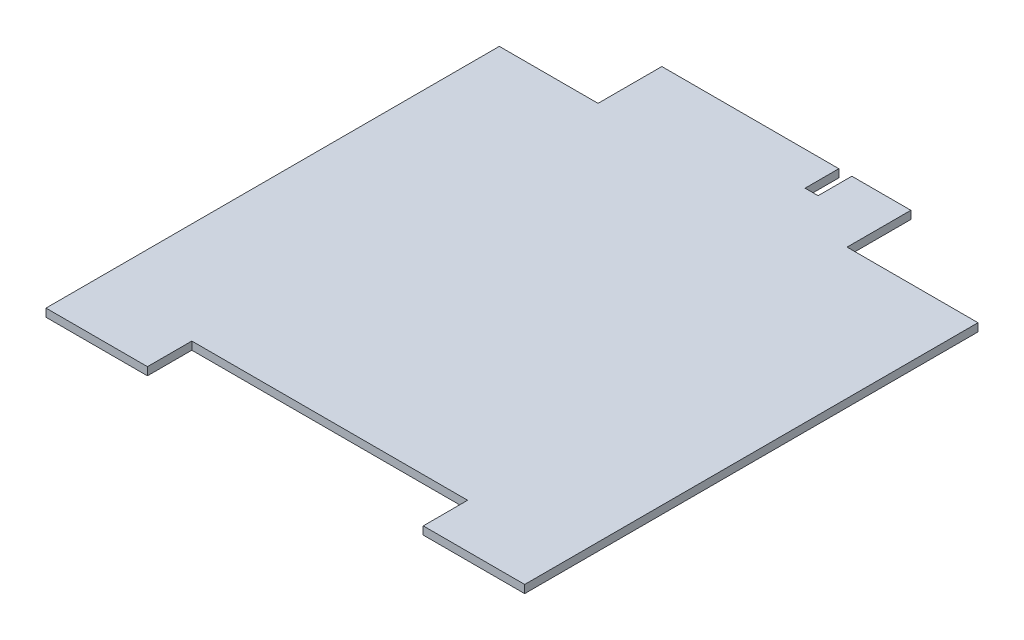
ISO-10303-21;
HEADER;
FILE_DESCRIPTION(('STEP AP214'),'2;1');
FILE_NAME('part.step','',(''),(''),'','','');
FILE_SCHEMA(('AUTOMOTIVE_DESIGN { 1 0 10303 214 1 1 1 1 }'));
ENDSEC;
DATA;
#1=APPLICATION_CONTEXT('core data for automotive mechanical design processes');
#2=APPLICATION_PROTOCOL_DEFINITION('international standard','automotive_design',2000,#1);
#3=PRODUCT_CONTEXT('',#1,'mechanical');
#4=PRODUCT('Part','Part','',(#3));
#5=PRODUCT_RELATED_PRODUCT_CATEGORY('part','',(#4));
#6=PRODUCT_DEFINITION_FORMATION('','',#4);
#7=PRODUCT_DEFINITION_CONTEXT('part definition',#1,'design');
#8=PRODUCT_DEFINITION('design','',#6,#7);
#9=PRODUCT_DEFINITION_SHAPE('','',#8);
#10=(LENGTH_UNIT() NAMED_UNIT(*) SI_UNIT(.MILLI.,.METRE.));
#11=(NAMED_UNIT(*) PLANE_ANGLE_UNIT() SI_UNIT($,.RADIAN.));
#12=(NAMED_UNIT(*) SI_UNIT($,.STERADIAN.) SOLID_ANGLE_UNIT());
#13=UNCERTAINTY_MEASURE_WITH_UNIT(LENGTH_MEASURE(1.E-05),#10,'distance_accuracy_value','');
#14=(GEOMETRIC_REPRESENTATION_CONTEXT(3) GLOBAL_UNCERTAINTY_ASSIGNED_CONTEXT((#13)) GLOBAL_UNIT_ASSIGNED_CONTEXT((#10,
#11,#12)) REPRESENTATION_CONTEXT('',''));
#15=CARTESIAN_POINT('',(0.,0.,0.));
#16=DIRECTION('',(0.,0.,1.));
#17=DIRECTION('',(1.,0.,0.));
#18=AXIS2_PLACEMENT_3D('',#15,#16,#17);
#19=CARTESIAN_POINT('',(0.,1.6,45.4025));
#20=DIRECTION('',(0.,0.,-1.));
#21=DIRECTION('',(-1.,0.,0.));
#22=AXIS2_PLACEMENT_3D('',#19,#20,#21);
#23=PLANE('',#22);
#24=DIRECTION('',(1.,0.,0.));
#25=VECTOR('',#24,1.);
#26=CARTESIAN_POINT('',(0.,0.,45.4025));
#27=LINE('',#26,#25);
#28=CARTESIAN_POINT('',(-47.9425,0.,45.4025));
#29=VERTEX_POINT('',#28);
#30=CARTESIAN_POINT('',(-27.6225,0.,45.4025));
#31=VERTEX_POINT('',#30);
#32=EDGE_CURVE('E174',#29,#31,#27,.T.);
#33=ORIENTED_EDGE('',*,*,#32,.T.);
#34=DIRECTION('',(0.,1.,0.));
#35=VECTOR('',#34,1.);
#36=CARTESIAN_POINT('',(-27.6225,-55.9557157491529,45.4025));
#37=LINE('',#36,#35);
#38=CARTESIAN_POINT('',(-27.6225,1.6,45.4025));
#39=VERTEX_POINT('',#38);
#40=EDGE_CURVE('E156',#31,#39,#37,.T.);
#41=ORIENTED_EDGE('',*,*,#40,.T.);
#42=DIRECTION('',(1.,0.,0.));
#43=VECTOR('',#42,1.);
#44=CARTESIAN_POINT('',(0.,1.6,45.4025));
#45=LINE('',#44,#43);
#46=CARTESIAN_POINT('',(-47.9425,1.6,45.4025));
#47=VERTEX_POINT('',#46);
#48=EDGE_CURVE('E171',#47,#39,#45,.T.);
#49=ORIENTED_EDGE('',*,*,#48,.F.);
#50=DIRECTION('',(0.,-1.,0.));
#51=VECTOR('',#50,1.);
#52=CARTESIAN_POINT('',(-47.9425,1.6,45.4025));
#53=LINE('',#52,#51);
#54=EDGE_CURVE('E251',#47,#29,#53,.T.);
#55=ORIENTED_EDGE('',*,*,#54,.T.);
#56=EDGE_LOOP('',(#33,#41,#49,#55));
#57=FACE_BOUND('',#56,.T.);
#58=ADVANCED_FACE('F41',(#57),#23,.F.);
#59=CARTESIAN_POINT('',(0.,1.6,-58.1828881425));
#60=DIRECTION('',(0.,0.,-1.));
#61=DIRECTION('',(-1.,0.,0.));
#62=AXIS2_PLACEMENT_3D('',#59,#60,#61);
#63=PLANE('',#62);
#64=DIRECTION('',(0.,1.,0.));
#65=VECTOR('',#64,1.);
#66=CARTESIAN_POINT('',(7.28257435357213,-55.9557157491529,-58.1828881425));
#67=LINE('',#66,#65);
#68=CARTESIAN_POINT('',(7.28257435357213,0.,-58.1828881425));
#69=VERTEX_POINT('',#68);
#70=CARTESIAN_POINT('',(7.28257435357213,1.6,-58.1828881425));
#71=VERTEX_POINT('',#70);
#72=EDGE_CURVE('E288',#69,#71,#67,.T.);
#73=ORIENTED_EDGE('',*,*,#72,.F.);
#74=DIRECTION('',(1.,0.,0.));
#75=VECTOR('',#74,1.);
#76=CARTESIAN_POINT('',(0.,0.,-58.1828881425));
#77=LINE('',#76,#75);
#78=CARTESIAN_POINT('',(-28.1675306770798,0.,-58.1828881425));
#79=VERTEX_POINT('',#78);
#80=EDGE_CURVE('E230',#79,#69,#77,.T.);
#81=ORIENTED_EDGE('',*,*,#80,.F.);
#82=DIRECTION('',(0.,-1.,0.));
#83=VECTOR('',#82,1.);
#84=CARTESIAN_POINT('',(-28.1675306770798,1.6,-58.1828881425));
#85=LINE('',#84,#83);
#86=CARTESIAN_POINT('',(-28.1675306770798,1.6,-58.1828881425));
#87=VERTEX_POINT('',#86);
#88=EDGE_CURVE('E203',#87,#79,#85,.T.);
#89=ORIENTED_EDGE('',*,*,#88,.F.);
#90=DIRECTION('',(1.,0.,0.));
#91=VECTOR('',#90,1.);
#92=CARTESIAN_POINT('',(0.,1.6,-58.1828881425));
#93=LINE('',#92,#91);
#94=EDGE_CURVE('E199',#87,#71,#93,.T.);
#95=ORIENTED_EDGE('',*,*,#94,.T.);
#96=EDGE_LOOP('',(#73,#81,#89,#95));
#97=FACE_BOUND('',#96,.T.);
#98=ADVANCED_FACE('F359',(#97),#63,.T.);
#99=CARTESIAN_POINT('',(-28.1675306770798,1.6,0.));
#100=DIRECTION('',(-1.,0.,0.));
#101=DIRECTION('',(0.,0.,1.));
#102=AXIS2_PLACEMENT_3D('',#99,#100,#101);
#103=PLANE('',#102);
#104=DIRECTION('',(0.,0.,-1.));
#105=VECTOR('',#104,1.);
#106=CARTESIAN_POINT('',(-28.1675306770798,0.,0.));
#107=LINE('',#106,#105);
#108=CARTESIAN_POINT('',(-28.1675306770798,0.,-45.4025));
#109=VERTEX_POINT('',#108);
#110=EDGE_CURVE('E204',#109,#79,#107,.T.);
#111=ORIENTED_EDGE('',*,*,#110,.F.);
#112=DIRECTION('',(0.,-1.,0.));
#113=VECTOR('',#112,1.);
#114=CARTESIAN_POINT('',(-28.1675306770798,1.6,-45.4025));
#115=LINE('',#114,#113);
#116=CARTESIAN_POINT('',(-28.1675306770798,1.6,-45.4025));
#117=VERTEX_POINT('',#116);
#118=EDGE_CURVE('E11',#117,#109,#115,.T.);
#119=ORIENTED_EDGE('',*,*,#118,.F.);
#120=DIRECTION('',(0.,0.,-1.));
#121=VECTOR('',#120,1.);
#122=CARTESIAN_POINT('',(-28.1675306770798,1.6,0.));
#123=LINE('',#122,#121);
#124=EDGE_CURVE('E234',#117,#87,#123,.T.);
#125=ORIENTED_EDGE('',*,*,#124,.T.);
#126=ORIENTED_EDGE('',*,*,#88,.T.);
#127=EDGE_LOOP('',(#111,#119,#125,#126));
#128=FACE_BOUND('',#127,.T.);
#129=ADVANCED_FACE('F43',(#128),#103,.T.);
#130=CARTESIAN_POINT('',(0.,1.6,-45.4025));
#131=DIRECTION('',(0.,0.,-1.));
#132=DIRECTION('',(-1.,0.,0.));
#133=AXIS2_PLACEMENT_3D('',#130,#131,#132);
#134=PLANE('',#133);
#135=DIRECTION('',(1.,0.,0.));
#136=VECTOR('',#135,1.);
#137=CARTESIAN_POINT('',(0.,0.,-45.4025));
#138=LINE('',#137,#136);
#139=CARTESIAN_POINT('',(-47.9425,0.,-45.4025));
#140=VERTEX_POINT('',#139);
#141=EDGE_CURVE('E208',#140,#109,#138,.T.);
#142=ORIENTED_EDGE('',*,*,#141,.F.);
#143=DIRECTION('',(0.,-1.,0.));
#144=VECTOR('',#143,1.);
#145=CARTESIAN_POINT('',(-47.9425,1.6,-45.4025));
#146=LINE('',#145,#144);
#147=CARTESIAN_POINT('',(-47.9425,1.6,-45.4025));
#148=VERTEX_POINT('',#147);
#149=EDGE_CURVE('E50',#148,#140,#146,.T.);
#150=ORIENTED_EDGE('',*,*,#149,.F.);
#151=DIRECTION('',(1.,0.,0.));
#152=VECTOR('',#151,1.);
#153=CARTESIAN_POINT('',(0.,1.6,-45.4025));
#154=LINE('',#153,#152);
#155=EDGE_CURVE('E316',#148,#117,#154,.T.);
#156=ORIENTED_EDGE('',*,*,#155,.T.);
#157=ORIENTED_EDGE('',*,*,#118,.T.);
#158=EDGE_LOOP('',(#142,#150,#156,#157));
#159=FACE_BOUND('',#158,.T.);
#160=ADVANCED_FACE('F260',(#159),#134,.T.);
#161=CARTESIAN_POINT('',(-47.9425,1.6,0.));
#162=DIRECTION('',(-1.,0.,0.));
#163=DIRECTION('',(0.,0.,1.));
#164=AXIS2_PLACEMENT_3D('',#161,#162,#163);
#165=PLANE('',#164);
#166=DIRECTION('',(0.,0.,-1.));
#167=VECTOR('',#166,1.);
#168=CARTESIAN_POINT('',(-47.9425,0.,0.));
#169=LINE('',#168,#167);
#170=EDGE_CURVE('E213',#29,#140,#169,.T.);
#171=ORIENTED_EDGE('',*,*,#170,.F.);
#172=ORIENTED_EDGE('',*,*,#54,.F.);
#173=DIRECTION('',(0.,0.,-1.));
#174=VECTOR('',#173,1.);
#175=CARTESIAN_POINT('',(-47.9425,1.6,0.));
#176=LINE('',#175,#174);
#177=EDGE_CURVE('E182',#47,#148,#176,.T.);
#178=ORIENTED_EDGE('',*,*,#177,.T.);
#179=ORIENTED_EDGE('',*,*,#149,.T.);
#180=EDGE_LOOP('',(#171,#172,#178,#179));
#181=FACE_BOUND('',#180,.T.);
#182=ADVANCED_FACE('F257',(#181),#165,.T.);
#183=CARTESIAN_POINT('',(27.6225,1.6,45.4025));
#184=VERTEX_POINT('',#183);
#185=CARTESIAN_POINT('',(47.9425,1.6,45.4025));
#186=VERTEX_POINT('',#185);
#187=EDGE_CURVE('E185',#184,#186,#45,.T.);
#188=ORIENTED_EDGE('',*,*,#187,.F.);
#189=DIRECTION('',(0.,1.,0.));
#190=VECTOR('',#189,1.);
#191=CARTESIAN_POINT('',(27.6225,-55.9557157491529,45.4025));
#192=LINE('',#191,#190);
#193=CARTESIAN_POINT('',(27.6225,0.,45.4025));
#194=VERTEX_POINT('',#193);
#195=EDGE_CURVE('E176',#194,#184,#192,.T.);
#196=ORIENTED_EDGE('',*,*,#195,.F.);
#197=CARTESIAN_POINT('',(47.9425,0.,45.4025));
#198=VERTEX_POINT('',#197);
#199=EDGE_CURVE('E218',#194,#198,#27,.T.);
#200=ORIENTED_EDGE('',*,*,#199,.T.);
#201=DIRECTION('',(0.,-1.,0.));
#202=VECTOR('',#201,1.);
#203=CARTESIAN_POINT('',(47.9425,1.6,45.4025));
#204=LINE('',#203,#202);
#205=EDGE_CURVE('E247',#186,#198,#204,.T.);
#206=ORIENTED_EDGE('',*,*,#205,.F.);
#207=EDGE_LOOP('',(#188,#196,#200,#206));
#208=FACE_BOUND('',#207,.T.);
#209=ADVANCED_FACE('F344',(#208),#23,.F.);
#210=CARTESIAN_POINT('',(47.9425,1.6,0.));
#211=DIRECTION('',(-1.,0.,0.));
#212=DIRECTION('',(0.,0.,1.));
#213=AXIS2_PLACEMENT_3D('',#210,#211,#212);
#214=PLANE('',#213);
#215=DIRECTION('',(0.,0.,-1.));
#216=VECTOR('',#215,1.);
#217=CARTESIAN_POINT('',(47.9425,0.,0.));
#218=LINE('',#217,#216);
#219=CARTESIAN_POINT('',(47.9425,0.,-45.4025));
#220=VERTEX_POINT('',#219);
#221=EDGE_CURVE('E221',#198,#220,#218,.T.);
#222=ORIENTED_EDGE('',*,*,#221,.T.);
#223=DIRECTION('',(0.,-1.,0.));
#224=VECTOR('',#223,1.);
#225=CARTESIAN_POINT('',(47.9425,1.6,-45.4025));
#226=LINE('',#225,#224);
#227=CARTESIAN_POINT('',(47.9425,1.6,-45.4025));
#228=VERTEX_POINT('',#227);
#229=EDGE_CURVE('E244',#228,#220,#226,.T.);
#230=ORIENTED_EDGE('',*,*,#229,.F.);
#231=DIRECTION('',(0.,0.,-1.));
#232=VECTOR('',#231,1.);
#233=CARTESIAN_POINT('',(47.9425,1.6,0.));
#234=LINE('',#233,#232);
#235=EDGE_CURVE('E184',#186,#228,#234,.T.);
#236=ORIENTED_EDGE('',*,*,#235,.F.);
#237=ORIENTED_EDGE('',*,*,#205,.T.);
#238=EDGE_LOOP('',(#222,#230,#236,#237));
#239=FACE_BOUND('',#238,.T.);
#240=ADVANCED_FACE('F334',(#239),#214,.F.);
#241=CARTESIAN_POINT('',(21.71330638,0.,-45.4025));
#242=VERTEX_POINT('',#241);
#243=EDGE_CURVE('E214',#242,#220,#138,.T.);
#244=ORIENTED_EDGE('',*,*,#243,.F.);
#245=DIRECTION('',(0.,-1.,0.));
#246=VECTOR('',#245,1.);
#247=CARTESIAN_POINT('',(21.71330638,1.6,-45.4025));
#248=LINE('',#247,#246);
#249=CARTESIAN_POINT('',(21.71330638,1.6,-45.4025));
#250=VERTEX_POINT('',#249);
#251=EDGE_CURVE('E241',#250,#242,#248,.T.);
#252=ORIENTED_EDGE('',*,*,#251,.F.);
#253=EDGE_CURVE('E189',#250,#228,#154,.T.);
#254=ORIENTED_EDGE('',*,*,#253,.T.);
#255=ORIENTED_EDGE('',*,*,#229,.T.);
#256=EDGE_LOOP('',(#244,#252,#254,#255));
#257=FACE_BOUND('',#256,.T.);
#258=ADVANCED_FACE('F324',(#257),#134,.T.);
#259=CARTESIAN_POINT('',(21.71330638,1.6,0.));
#260=DIRECTION('',(-1.,0.,0.));
#261=DIRECTION('',(0.,0.,1.));
#262=AXIS2_PLACEMENT_3D('',#259,#260,#261);
#263=PLANE('',#262);
#264=DIRECTION('',(0.,0.,-1.));
#265=VECTOR('',#264,1.);
#266=CARTESIAN_POINT('',(21.71330638,0.,0.));
#267=LINE('',#266,#265);
#268=CARTESIAN_POINT('',(21.71330638,0.,-58.1828881425));
#269=VERTEX_POINT('',#268);
#270=EDGE_CURVE('E225',#242,#269,#267,.T.);
#271=ORIENTED_EDGE('',*,*,#270,.T.);
#272=DIRECTION('',(0.,-1.,0.));
#273=VECTOR('',#272,1.);
#274=CARTESIAN_POINT('',(21.71330638,1.6,-58.1828881425));
#275=LINE('',#274,#273);
#276=CARTESIAN_POINT('',(21.71330638,1.6,-58.1828881425));
#277=VERTEX_POINT('',#276);
#278=EDGE_CURVE('E237',#277,#269,#275,.T.);
#279=ORIENTED_EDGE('',*,*,#278,.F.);
#280=DIRECTION('',(0.,0.,-1.));
#281=VECTOR('',#280,1.);
#282=CARTESIAN_POINT('',(21.71330638,1.6,0.));
#283=LINE('',#282,#281);
#284=EDGE_CURVE('E194',#250,#277,#283,.T.);
#285=ORIENTED_EDGE('',*,*,#284,.F.);
#286=ORIENTED_EDGE('',*,*,#251,.T.);
#287=EDGE_LOOP('',(#271,#279,#285,#286));
#288=FACE_BOUND('',#287,.T.);
#289=ADVANCED_FACE('F383',(#288),#263,.F.);
#290=DIRECTION('',(0.,1.,0.));
#291=VECTOR('',#290,1.);
#292=CARTESIAN_POINT('',(9.89330855579612,-55.9557157491529,-58.1828881425));
#293=LINE('',#292,#291);
#294=CARTESIAN_POINT('',(9.89330855579612,0.,-58.1828881425));
#295=VERTEX_POINT('',#294);
#296=CARTESIAN_POINT('',(9.89330855579612,1.6,-58.1828881425));
#297=VERTEX_POINT('',#296);
#298=EDGE_CURVE('E304',#295,#297,#293,.T.);
#299=ORIENTED_EDGE('',*,*,#298,.T.);
#300=EDGE_CURVE('E198',#297,#277,#93,.T.);
#301=ORIENTED_EDGE('',*,*,#300,.T.);
#302=ORIENTED_EDGE('',*,*,#278,.T.);
#303=EDGE_CURVE('E229',#295,#269,#77,.T.);
#304=ORIENTED_EDGE('',*,*,#303,.F.);
#305=EDGE_LOOP('',(#299,#301,#302,#304));
#306=FACE_BOUND('',#305,.T.);
#307=ADVANCED_FACE('F366',(#306),#63,.T.);
#308=CARTESIAN_POINT('',(0.,1.6,0.));
#309=DIRECTION('',(0.,1.,0.));
#310=DIRECTION('',(0.,0.,1.));
#311=AXIS2_PLACEMENT_3D('',#308,#309,#310);
#312=PLANE('',#311);
#313=DIRECTION('',(0.,0.,1.));
#314=VECTOR('',#313,1.);
#315=CARTESIAN_POINT('',(-27.6225,1.6,45.4025));
#316=LINE('',#315,#314);
#317=CARTESIAN_POINT('',(-27.6225,1.6,36.5125));
#318=VERTEX_POINT('',#317);
#319=EDGE_CURVE('E153',#318,#39,#316,.T.);
#320=ORIENTED_EDGE('',*,*,#319,.F.);
#321=DIRECTION('',(-1.,0.,0.));
#322=VECTOR('',#321,1.);
#323=CARTESIAN_POINT('',(-27.6225,1.6,36.5125));
#324=LINE('',#323,#322);
#325=CARTESIAN_POINT('',(27.6225,1.6,36.5125));
#326=VERTEX_POINT('',#325);
#327=EDGE_CURVE('E177',#326,#318,#324,.T.);
#328=ORIENTED_EDGE('',*,*,#327,.F.);
#329=DIRECTION('',(0.,0.,-1.));
#330=VECTOR('',#329,1.);
#331=CARTESIAN_POINT('',(27.6225,1.6,45.4025));
#332=LINE('',#331,#330);
#333=EDGE_CURVE('E165',#184,#326,#332,.T.);
#334=ORIENTED_EDGE('',*,*,#333,.F.);
#335=ORIENTED_EDGE('',*,*,#187,.T.);
#336=ORIENTED_EDGE('',*,*,#235,.T.);
#337=ORIENTED_EDGE('',*,*,#253,.F.);
#338=ORIENTED_EDGE('',*,*,#284,.T.);
#339=ORIENTED_EDGE('',*,*,#300,.F.);
#340=DIRECTION('',(0.,0.,-1.));
#341=VECTOR('',#340,1.);
#342=CARTESIAN_POINT('',(9.89330855579612,1.6,-58.1828881425));
#343=LINE('',#342,#341);
#344=CARTESIAN_POINT('',(9.89330855579612,1.6,-51.4228881425));
#345=VERTEX_POINT('',#344);
#346=EDGE_CURVE('E298',#345,#297,#343,.T.);
#347=ORIENTED_EDGE('',*,*,#346,.F.);
#348=DIRECTION('',(1.,0.,0.));
#349=VECTOR('',#348,1.);
#350=CARTESIAN_POINT('',(7.28257435357213,1.6,-51.4228881425));
#351=LINE('',#350,#349);
#352=CARTESIAN_POINT('',(7.28257435357213,1.6,-51.4228881425));
#353=VERTEX_POINT('',#352);
#354=EDGE_CURVE('E295',#353,#345,#351,.T.);
#355=ORIENTED_EDGE('',*,*,#354,.F.);
#356=DIRECTION('',(0.,0.,1.));
#357=VECTOR('',#356,1.);
#358=CARTESIAN_POINT('',(7.28257435357213,1.6,-58.1828881425));
#359=LINE('',#358,#357);
#360=EDGE_CURVE('E291',#71,#353,#359,.T.);
#361=ORIENTED_EDGE('',*,*,#360,.F.);
#362=ORIENTED_EDGE('',*,*,#94,.F.);
#363=ORIENTED_EDGE('',*,*,#124,.F.);
#364=ORIENTED_EDGE('',*,*,#155,.F.);
#365=ORIENTED_EDGE('',*,*,#177,.F.);
#366=ORIENTED_EDGE('',*,*,#48,.T.);
#367=EDGE_LOOP('',(#320,#328,#334,#335,#336,#337,#338,#339,#347,#355,#361,#362,#363,#364,#365,#366));
#368=FACE_BOUND('',#367,.T.);
#369=ADVANCED_FACE('F179',(#368),#312,.T.);
#370=CARTESIAN_POINT('',(0.,0.,0.));
#371=DIRECTION('',(0.,1.,0.));
#372=DIRECTION('',(0.,0.,1.));
#373=AXIS2_PLACEMENT_3D('',#370,#371,#372);
#374=PLANE('',#373);
#375=DIRECTION('',(1.,0.,0.));
#376=VECTOR('',#375,1.);
#377=CARTESIAN_POINT('',(-27.6225,0.,36.5125));
#378=LINE('',#377,#376);
#379=CARTESIAN_POINT('',(-27.6225,0.,36.5125));
#380=VERTEX_POINT('',#379);
#381=CARTESIAN_POINT('',(27.6225,0.,36.5125));
#382=VERTEX_POINT('',#381);
#383=EDGE_CURVE('E266',#380,#382,#378,.T.);
#384=ORIENTED_EDGE('',*,*,#383,.F.);
#385=DIRECTION('',(0.,0.,-1.));
#386=VECTOR('',#385,1.);
#387=CARTESIAN_POINT('',(-27.6225,0.,45.4025));
#388=LINE('',#387,#386);
#389=EDGE_CURVE('E209',#31,#380,#388,.T.);
#390=ORIENTED_EDGE('',*,*,#389,.F.);
#391=ORIENTED_EDGE('',*,*,#32,.F.);
#392=ORIENTED_EDGE('',*,*,#170,.T.);
#393=ORIENTED_EDGE('',*,*,#141,.T.);
#394=ORIENTED_EDGE('',*,*,#110,.T.);
#395=ORIENTED_EDGE('',*,*,#80,.T.);
#396=DIRECTION('',(0.,0.,-1.));
#397=VECTOR('',#396,1.);
#398=CARTESIAN_POINT('',(7.28257435357213,0.,-58.1828881425));
#399=LINE('',#398,#397);
#400=CARTESIAN_POINT('',(7.28257435357213,0.,-51.4228881425));
#401=VERTEX_POINT('',#400);
#402=EDGE_CURVE('E287',#401,#69,#399,.T.);
#403=ORIENTED_EDGE('',*,*,#402,.F.);
#404=DIRECTION('',(-1.,0.,0.));
#405=VECTOR('',#404,1.);
#406=CARTESIAN_POINT('',(7.28257435357213,0.,-51.4228881425));
#407=LINE('',#406,#405);
#408=CARTESIAN_POINT('',(9.89330855579612,0.,-51.4228881425));
#409=VERTEX_POINT('',#408);
#410=EDGE_CURVE('E166',#409,#401,#407,.T.);
#411=ORIENTED_EDGE('',*,*,#410,.F.);
#412=DIRECTION('',(0.,0.,1.));
#413=VECTOR('',#412,1.);
#414=CARTESIAN_POINT('',(9.89330855579612,0.,-58.1828881425));
#415=LINE('',#414,#413);
#416=EDGE_CURVE('E284',#295,#409,#415,.T.);
#417=ORIENTED_EDGE('',*,*,#416,.F.);
#418=ORIENTED_EDGE('',*,*,#303,.T.);
#419=ORIENTED_EDGE('',*,*,#270,.F.);
#420=ORIENTED_EDGE('',*,*,#243,.T.);
#421=ORIENTED_EDGE('',*,*,#221,.F.);
#422=ORIENTED_EDGE('',*,*,#199,.F.);
#423=DIRECTION('',(0.,0.,1.));
#424=VECTOR('',#423,1.);
#425=CARTESIAN_POINT('',(27.6225,0.,45.4025));
#426=LINE('',#425,#424);
#427=EDGE_CURVE('E270',#382,#194,#426,.T.);
#428=ORIENTED_EDGE('',*,*,#427,.F.);
#429=EDGE_LOOP('',(#384,#390,#391,#392,#393,#394,#395,#403,#411,#417,#418,#419,#420,#421,#422,#428));
#430=FACE_BOUND('',#429,.T.);
#431=ADVANCED_FACE('F264',(#430),#374,.F.);
#432=CARTESIAN_POINT('',(7.28257435357213,-55.9557157491529,-58.1828881425));
#433=DIRECTION('',(-1.,0.,0.));
#434=DIRECTION('',(0.,0.,1.));
#435=AXIS2_PLACEMENT_3D('',#432,#433,#434);
#436=PLANE('',#435);
#437=ORIENTED_EDGE('',*,*,#402,.T.);
#438=ORIENTED_EDGE('',*,*,#72,.T.);
#439=ORIENTED_EDGE('',*,*,#360,.T.);
#440=DIRECTION('',(0.,1.,0.));
#441=VECTOR('',#440,1.);
#442=CARTESIAN_POINT('',(7.28257435357213,-55.9557157491529,-51.4228881425));
#443=LINE('',#442,#441);
#444=EDGE_CURVE('E301',#401,#353,#443,.T.);
#445=ORIENTED_EDGE('',*,*,#444,.F.);
#446=EDGE_LOOP('',(#437,#438,#439,#445));
#447=FACE_BOUND('',#446,.T.);
#448=ADVANCED_FACE('F395',(#447),#436,.F.);
#449=CARTESIAN_POINT('',(9.89330855579612,-55.9557157491529,-58.1828881425));
#450=DIRECTION('',(1.,0.,0.));
#451=DIRECTION('',(0.,0.,-1.));
#452=AXIS2_PLACEMENT_3D('',#449,#450,#451);
#453=PLANE('',#452);
#454=ORIENTED_EDGE('',*,*,#416,.T.);
#455=DIRECTION('',(0.,1.,0.));
#456=VECTOR('',#455,1.);
#457=CARTESIAN_POINT('',(9.89330855579612,-55.9557157491529,-51.4228881425));
#458=LINE('',#457,#456);
#459=EDGE_CURVE('E65',#409,#345,#458,.T.);
#460=ORIENTED_EDGE('',*,*,#459,.T.);
#461=ORIENTED_EDGE('',*,*,#346,.T.);
#462=ORIENTED_EDGE('',*,*,#298,.F.);
#463=EDGE_LOOP('',(#454,#460,#461,#462));
#464=FACE_BOUND('',#463,.T.);
#465=ADVANCED_FACE('F400',(#464),#453,.F.);
#466=CARTESIAN_POINT('',(7.28257435357213,-55.9557157491529,-51.4228881425));
#467=DIRECTION('',(0.,0.,1.));
#468=DIRECTION('',(1.,0.,0.));
#469=AXIS2_PLACEMENT_3D('',#466,#467,#468);
#470=PLANE('',#469);
#471=ORIENTED_EDGE('',*,*,#410,.T.);
#472=ORIENTED_EDGE('',*,*,#444,.T.);
#473=ORIENTED_EDGE('',*,*,#354,.T.);
#474=ORIENTED_EDGE('',*,*,#459,.F.);
#475=EDGE_LOOP('',(#471,#472,#473,#474));
#476=FACE_BOUND('',#475,.T.);
#477=ADVANCED_FACE('F356',(#476),#470,.F.);
#478=CARTESIAN_POINT('',(-27.6225,-55.9557157491529,45.4025));
#479=DIRECTION('',(-1.,0.,0.));
#480=DIRECTION('',(0.,0.,1.));
#481=AXIS2_PLACEMENT_3D('',#478,#479,#480);
#482=PLANE('',#481);
#483=ORIENTED_EDGE('',*,*,#389,.T.);
#484=DIRECTION('',(0.,1.,0.));
#485=VECTOR('',#484,1.);
#486=CARTESIAN_POINT('',(-27.6225,-55.9557157491529,36.5125));
#487=LINE('',#486,#485);
#488=EDGE_CURVE('E159',#380,#318,#487,.T.);
#489=ORIENTED_EDGE('',*,*,#488,.T.);
#490=ORIENTED_EDGE('',*,*,#319,.T.);
#491=ORIENTED_EDGE('',*,*,#40,.F.);
#492=EDGE_LOOP('',(#483,#489,#490,#491));
#493=FACE_BOUND('',#492,.T.);
#494=ADVANCED_FACE('F155',(#493),#482,.F.);
#495=CARTESIAN_POINT('',(-27.6225,-55.9557157491529,36.5125));
#496=DIRECTION('',(0.,0.,-1.));
#497=DIRECTION('',(-1.,0.,0.));
#498=AXIS2_PLACEMENT_3D('',#495,#496,#497);
#499=PLANE('',#498);
#500=ORIENTED_EDGE('',*,*,#383,.T.);
#501=DIRECTION('',(0.,1.,0.));
#502=VECTOR('',#501,1.);
#503=CARTESIAN_POINT('',(27.6225,-55.9557157491529,36.5125));
#504=LINE('',#503,#502);
#505=EDGE_CURVE('E57',#382,#326,#504,.T.);
#506=ORIENTED_EDGE('',*,*,#505,.T.);
#507=ORIENTED_EDGE('',*,*,#327,.T.);
#508=ORIENTED_EDGE('',*,*,#488,.F.);
#509=EDGE_LOOP('',(#500,#506,#507,#508));
#510=FACE_BOUND('',#509,.T.);
#511=ADVANCED_FACE('F348',(#510),#499,.F.);
#512=CARTESIAN_POINT('',(27.6225,-55.9557157491529,45.4025));
#513=DIRECTION('',(1.,0.,0.));
#514=DIRECTION('',(0.,0.,-1.));
#515=AXIS2_PLACEMENT_3D('',#512,#513,#514);
#516=PLANE('',#515);
#517=ORIENTED_EDGE('',*,*,#427,.T.);
#518=ORIENTED_EDGE('',*,*,#195,.T.);
#519=ORIENTED_EDGE('',*,*,#333,.T.);
#520=ORIENTED_EDGE('',*,*,#505,.F.);
#521=EDGE_LOOP('',(#517,#518,#519,#520));
#522=FACE_BOUND('',#521,.T.);
#523=ADVANCED_FACE('F346',(#522),#516,.F.);
#524=CLOSED_SHELL('',(#58,#98,#129,#160,#182,#209,#240,#258,#289,#307,#369,#431,#448,#465,#477,
#494,#511,#523));
#525=MANIFOLD_SOLID_BREP('B2',#524);
#526=ADVANCED_BREP_SHAPE_REPRESENTATION('',(#18,#525),#14);
#527=SHAPE_DEFINITION_REPRESENTATION(#9,#526);
ENDSEC;
END-ISO-10303-21;
